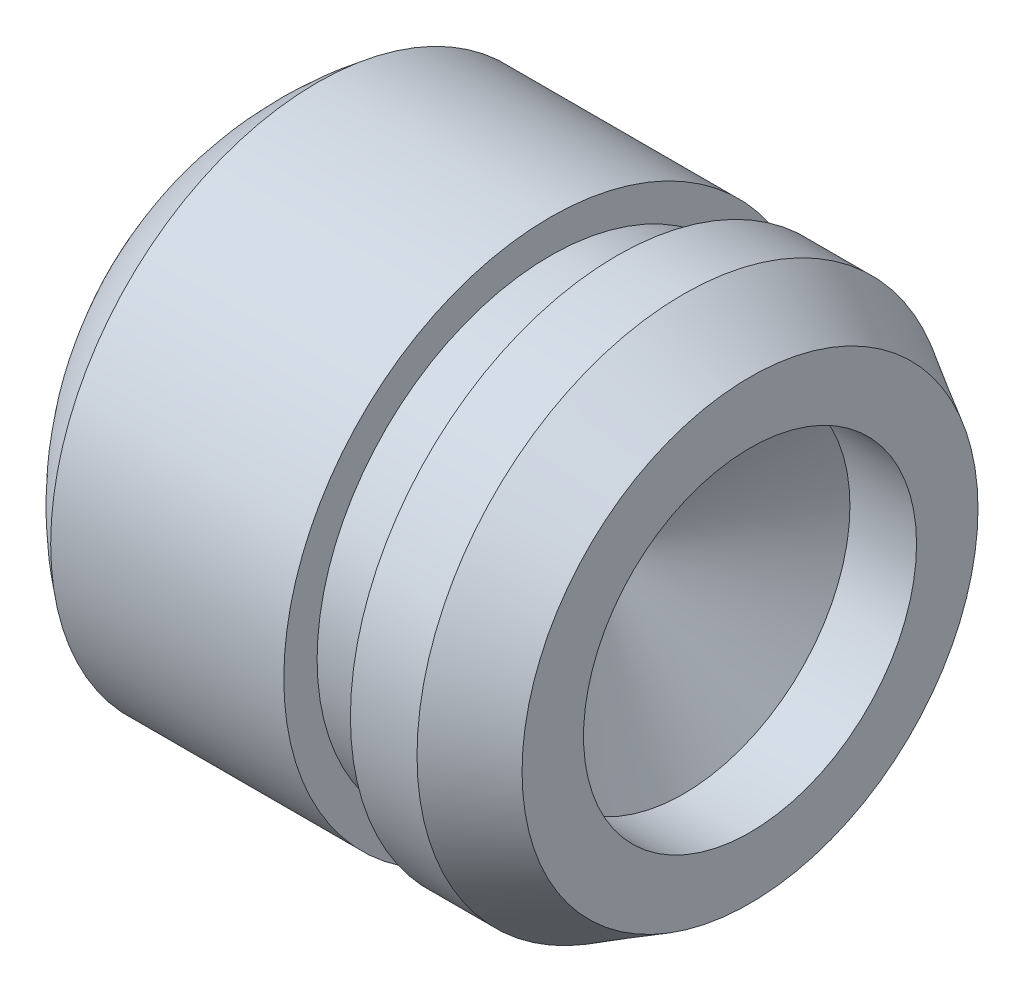
ISO-10303-21;
HEADER;
FILE_DESCRIPTION(('STEP AP214'),'2;1');
FILE_NAME('part.step','',(''),(''),'','','');
FILE_SCHEMA(('AUTOMOTIVE_DESIGN { 1 0 10303 214 1 1 1 1 }'));
ENDSEC;
DATA;
#1=APPLICATION_CONTEXT('core data for automotive mechanical design processes');
#2=APPLICATION_PROTOCOL_DEFINITION('international standard','automotive_design',2000,#1);
#3=PRODUCT_CONTEXT('',#1,'mechanical');
#4=PRODUCT('Part','Part','',(#3));
#5=PRODUCT_RELATED_PRODUCT_CATEGORY('part','',(#4));
#6=PRODUCT_DEFINITION_FORMATION('','',#4);
#7=PRODUCT_DEFINITION_CONTEXT('part definition',#1,'design');
#8=PRODUCT_DEFINITION('design','',#6,#7);
#9=PRODUCT_DEFINITION_SHAPE('','',#8);
#10=(LENGTH_UNIT() NAMED_UNIT(*) SI_UNIT(.MILLI.,.METRE.));
#11=(NAMED_UNIT(*) PLANE_ANGLE_UNIT() SI_UNIT($,.RADIAN.));
#12=(NAMED_UNIT(*) SI_UNIT($,.STERADIAN.) SOLID_ANGLE_UNIT());
#13=UNCERTAINTY_MEASURE_WITH_UNIT(LENGTH_MEASURE(1.E-05),#10,'distance_accuracy_value','');
#14=(GEOMETRIC_REPRESENTATION_CONTEXT(3) GLOBAL_UNCERTAINTY_ASSIGNED_CONTEXT((#13)) GLOBAL_UNIT_ASSIGNED_CONTEXT((#10,
#11,#12)) REPRESENTATION_CONTEXT('',''));
#15=CARTESIAN_POINT('',(0.,0.,0.));
#16=DIRECTION('',(0.,0.,1.));
#17=DIRECTION('',(1.,0.,0.));
#18=AXIS2_PLACEMENT_3D('',#15,#16,#17);
#19=CARTESIAN_POINT('',(10.,0.,0.));
#20=DIRECTION('',(-1.,0.,0.));
#21=DIRECTION('',(0.,1.,0.));
#22=AXIS2_PLACEMENT_3D('',#19,#20,#21);
#23=SPHERICAL_SURFACE('',#22,10.);
#24=CARTESIAN_POINT('',(4.,0.,0.));
#25=DIRECTION('',(-1.,0.,0.));
#26=DIRECTION('',(0.,0.,1.));
#27=AXIS2_PLACEMENT_3D('',#24,#25,#26);
#28=CIRCLE('',#27,8.);
#29=CARTESIAN_POINT('',(4.,0.,8.));
#30=VERTEX_POINT('',#29);
#31=EDGE_CURVE('E11',#30,#30,#28,.T.);
#32=ORIENTED_EDGE('',*,*,#31,.T.);
#33=EDGE_LOOP('',(#32));
#34=FACE_BOUND('',#33,.T.);
#35=ADVANCED_FACE('F45',(#34),#23,.T.);
#36=CARTESIAN_POINT('',(0.,0.,0.));
#37=DIRECTION('',(-1.,0.,0.));
#38=DIRECTION('',(0.,0.,1.));
#39=AXIS2_PLACEMENT_3D('',#36,#37,#38);
#40=CYLINDRICAL_SURFACE('',#39,8.);
#41=ORIENTED_EDGE('',*,*,#31,.F.);
#42=EDGE_LOOP('',(#41));
#43=FACE_BOUND('',#42,.T.);
#44=CARTESIAN_POINT('',(11.,0.,0.));
#45=DIRECTION('',(-1.,0.,0.));
#46=DIRECTION('',(0.,0.,1.));
#47=AXIS2_PLACEMENT_3D('',#44,#45,#46);
#48=CIRCLE('',#47,8.);
#49=CARTESIAN_POINT('',(11.,0.,8.));
#50=VERTEX_POINT('',#49);
#51=EDGE_CURVE('E52',#50,#50,#48,.T.);
#52=ORIENTED_EDGE('',*,*,#51,.T.);
#53=EDGE_LOOP('',(#52));
#54=FACE_BOUND('',#53,.T.);
#55=ADVANCED_FACE('F97',(#43,#54),#40,.T.);
#56=CARTESIAN_POINT('',(11.,7.,0.));
#57=DIRECTION('',(-1.,0.,0.));
#58=DIRECTION('',(0.,0.,1.));
#59=AXIS2_PLACEMENT_3D('',#56,#57,#58);
#60=PLANE('',#59);
#61=ORIENTED_EDGE('',*,*,#51,.F.);
#62=EDGE_LOOP('',(#61));
#63=FACE_BOUND('',#62,.T.);
#64=CARTESIAN_POINT('',(11.,0.,0.));
#65=DIRECTION('',(-1.,0.,0.));
#66=DIRECTION('',(0.,0.,1.));
#67=AXIS2_PLACEMENT_3D('',#64,#65,#66);
#68=CIRCLE('',#67,7.);
#69=CARTESIAN_POINT('',(11.,0.,7.));
#70=VERTEX_POINT('',#69);
#71=EDGE_CURVE('E89',#70,#70,#68,.T.);
#72=ORIENTED_EDGE('',*,*,#71,.T.);
#73=EDGE_LOOP('',(#72));
#74=FACE_BOUND('',#73,.T.);
#75=ADVANCED_FACE('F99',(#63,#74),#60,.F.);
#76=CARTESIAN_POINT('',(0.,0.,0.));
#77=DIRECTION('',(-1.,0.,0.));
#78=DIRECTION('',(0.,0.,1.));
#79=AXIS2_PLACEMENT_3D('',#76,#77,#78);
#80=CYLINDRICAL_SURFACE('',#79,7.);
#81=ORIENTED_EDGE('',*,*,#71,.F.);
#82=EDGE_LOOP('',(#81));
#83=FACE_BOUND('',#82,.T.);
#84=CARTESIAN_POINT('',(13.,0.,0.));
#85=DIRECTION('',(-1.,0.,0.));
#86=DIRECTION('',(0.,0.,1.));
#87=AXIS2_PLACEMENT_3D('',#84,#85,#86);
#88=CIRCLE('',#87,7.);
#89=CARTESIAN_POINT('',(13.,0.,7.));
#90=VERTEX_POINT('',#89);
#91=EDGE_CURVE('E85',#90,#90,#88,.T.);
#92=ORIENTED_EDGE('',*,*,#91,.T.);
#93=EDGE_LOOP('',(#92));
#94=FACE_BOUND('',#93,.T.);
#95=ADVANCED_FACE('F102',(#83,#94),#80,.T.);
#96=CARTESIAN_POINT('',(13.,8.,0.));
#97=DIRECTION('',(1.,0.,0.));
#98=DIRECTION('',(0.,0.,-1.));
#99=AXIS2_PLACEMENT_3D('',#96,#97,#98);
#100=PLANE('',#99);
#101=ORIENTED_EDGE('',*,*,#91,.F.);
#102=EDGE_LOOP('',(#101));
#103=FACE_BOUND('',#102,.T.);
#104=CARTESIAN_POINT('',(13.,0.,0.));
#105=DIRECTION('',(-1.,0.,0.));
#106=DIRECTION('',(0.,0.,1.));
#107=AXIS2_PLACEMENT_3D('',#104,#105,#106);
#108=CIRCLE('',#107,8.);
#109=CARTESIAN_POINT('',(13.,0.,8.));
#110=VERTEX_POINT('',#109);
#111=EDGE_CURVE('E81',#110,#110,#108,.T.);
#112=ORIENTED_EDGE('',*,*,#111,.T.);
#113=EDGE_LOOP('',(#112));
#114=FACE_BOUND('',#113,.T.);
#115=ADVANCED_FACE('F108',(#103,#114),#100,.F.);
#116=CARTESIAN_POINT('',(0.,0.,0.));
#117=DIRECTION('',(-1.,0.,0.));
#118=DIRECTION('',(0.,0.,1.));
#119=AXIS2_PLACEMENT_3D('',#116,#117,#118);
#120=CYLINDRICAL_SURFACE('',#119,8.);
#121=ORIENTED_EDGE('',*,*,#111,.F.);
#122=EDGE_LOOP('',(#121));
#123=FACE_BOUND('',#122,.T.);
#124=CARTESIAN_POINT('',(15.,0.,0.));
#125=DIRECTION('',(-1.,0.,0.));
#126=DIRECTION('',(0.,0.,1.));
#127=AXIS2_PLACEMENT_3D('',#124,#125,#126);
#128=CIRCLE('',#127,8.);
#129=CARTESIAN_POINT('',(15.,0.,8.));
#130=VERTEX_POINT('',#129);
#131=EDGE_CURVE('E73',#130,#130,#128,.T.);
#132=ORIENTED_EDGE('',*,*,#131,.T.);
#133=EDGE_LOOP('',(#132));
#134=FACE_BOUND('',#133,.T.);
#135=ADVANCED_FACE('F114',(#123,#134),#120,.T.);
#136=CARTESIAN_POINT('',(17.,0.,0.));
#137=DIRECTION('',(-1.,0.,0.));
#138=DIRECTION('',(0.,0.,1.));
#139=AXIS2_PLACEMENT_3D('',#136,#137,#138);
#140=CONICAL_SURFACE('',#139,6.84529946162077,0.523598775598293);
#141=ORIENTED_EDGE('',*,*,#131,.F.);
#142=EDGE_LOOP('',(#141));
#143=FACE_BOUND('',#142,.T.);
#144=CARTESIAN_POINT('',(17.,0.,0.));
#145=DIRECTION('',(-1.,0.,0.));
#146=DIRECTION('',(0.,0.,1.));
#147=AXIS2_PLACEMENT_3D('',#144,#145,#146);
#148=CIRCLE('',#147,6.84529946162077);
#149=CARTESIAN_POINT('',(17.,0.,6.84529946162077));
#150=VERTEX_POINT('',#149);
#151=EDGE_CURVE('E66',#150,#150,#148,.T.);
#152=ORIENTED_EDGE('',*,*,#151,.T.);
#153=EDGE_LOOP('',(#152));
#154=FACE_BOUND('',#153,.T.);
#155=ADVANCED_FACE('F120',(#143,#154),#140,.T.);
#156=CARTESIAN_POINT('',(17.,0.,0.));
#157=DIRECTION('',(-1.,0.,0.));
#158=DIRECTION('',(0.,0.,1.));
#159=AXIS2_PLACEMENT_3D('',#156,#157,#158);
#160=PLANE('',#159);
#161=CARTESIAN_POINT('',(17.,0.,0.));
#162=DIRECTION('',(1.,0.,0.));
#163=DIRECTION('',(0.,0.,-1.));
#164=AXIS2_PLACEMENT_3D('',#161,#162,#163);
#165=CIRCLE('',#164,4.99999999999999);
#166=CARTESIAN_POINT('',(17.,0.,-4.99999999999999));
#167=VERTEX_POINT('',#166);
#168=EDGE_CURVE('E67',#167,#167,#165,.T.);
#169=ORIENTED_EDGE('',*,*,#168,.F.);
#170=EDGE_LOOP('',(#169));
#171=FACE_BOUND('',#170,.T.);
#172=ORIENTED_EDGE('',*,*,#151,.F.);
#173=EDGE_LOOP('',(#172));
#174=FACE_BOUND('',#173,.T.);
#175=ADVANCED_FACE('F59',(#171,#174),#160,.F.);
#176=CARTESIAN_POINT('',(15.,0.,0.));
#177=DIRECTION('',(1.,0.,0.));
#178=DIRECTION('',(0.,0.,-1.));
#179=AXIS2_PLACEMENT_3D('',#176,#177,#178);
#180=CONICAL_SURFACE('',#179,5.,1.02974425867665);
#181=CARTESIAN_POINT('',(11.9956969048622,0.,0.));
#182=VERTEX_POINT('',#181);
#183=VERTEX_LOOP('',#182);
#184=FACE_BOUND('',#183,.T.);
#185=CARTESIAN_POINT('',(15.,0.,0.));
#186=DIRECTION('',(1.,0.,0.));
#187=DIRECTION('',(0.,0.,-1.));
#188=AXIS2_PLACEMENT_3D('',#185,#186,#187);
#189=CIRCLE('',#188,5.);
#190=CARTESIAN_POINT('',(15.,0.,-5.));
#191=VERTEX_POINT('',#190);
#192=EDGE_CURVE('E63',#191,#191,#189,.T.);
#193=ORIENTED_EDGE('',*,*,#192,.T.);
#194=EDGE_LOOP('',(#193));
#195=FACE_BOUND('',#194,.T.);
#196=ADVANCED_FACE('F55',(#184,#195),#180,.F.);
#197=CARTESIAN_POINT('',(17.,0.,0.));
#198=DIRECTION('',(1.,0.,0.));
#199=DIRECTION('',(0.,0.,-1.));
#200=AXIS2_PLACEMENT_3D('',#197,#198,#199);
#201=CYLINDRICAL_SURFACE('',#200,4.99999999999999);
#202=ORIENTED_EDGE('',*,*,#192,.F.);
#203=EDGE_LOOP('',(#202));
#204=FACE_BOUND('',#203,.T.);
#205=ORIENTED_EDGE('',*,*,#168,.T.);
#206=EDGE_LOOP('',(#205));
#207=FACE_BOUND('',#206,.T.);
#208=ADVANCED_FACE('F58',(#204,#207),#201,.F.);
#209=CLOSED_SHELL('',(#35,#55,#75,#95,#115,#135,#155,#175,#196,#208));
#210=MANIFOLD_SOLID_BREP('B2',#209);
#211=ADVANCED_BREP_SHAPE_REPRESENTATION('',(#18,#210),#14);
#212=SHAPE_DEFINITION_REPRESENTATION(#9,#211);
ENDSEC;
END-ISO-10303-21;
